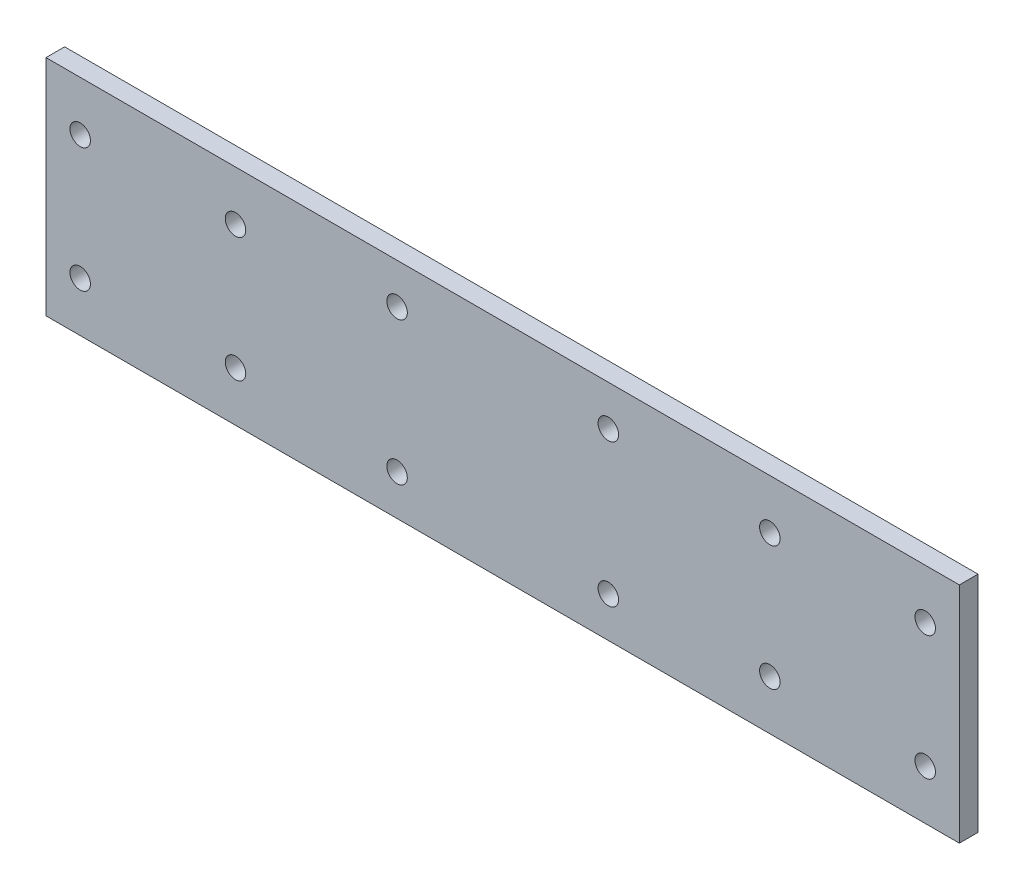
ISO-10303-21;
HEADER;
FILE_DESCRIPTION(('STEP AP214'),'2;1');
FILE_NAME('part.step','',(''),(''),'','','');
FILE_SCHEMA(('AUTOMOTIVE_DESIGN { 1 0 10303 214 1 1 1 1 }'));
ENDSEC;
DATA;
#1=APPLICATION_CONTEXT('core data for automotive mechanical design processes');
#2=APPLICATION_PROTOCOL_DEFINITION('international standard','automotive_design',2000,#1);
#3=PRODUCT_CONTEXT('',#1,'mechanical');
#4=PRODUCT('Part','Part','',(#3));
#5=PRODUCT_RELATED_PRODUCT_CATEGORY('part','',(#4));
#6=PRODUCT_DEFINITION_FORMATION('','',#4);
#7=PRODUCT_DEFINITION_CONTEXT('part definition',#1,'design');
#8=PRODUCT_DEFINITION('design','',#6,#7);
#9=PRODUCT_DEFINITION_SHAPE('','',#8);
#10=(LENGTH_UNIT() NAMED_UNIT(*) SI_UNIT(.MILLI.,.METRE.));
#11=(NAMED_UNIT(*) PLANE_ANGLE_UNIT() SI_UNIT($,.RADIAN.));
#12=(NAMED_UNIT(*) SI_UNIT($,.STERADIAN.) SOLID_ANGLE_UNIT());
#13=UNCERTAINTY_MEASURE_WITH_UNIT(LENGTH_MEASURE(1.E-05),#10,'distance_accuracy_value','');
#14=(GEOMETRIC_REPRESENTATION_CONTEXT(3) GLOBAL_UNCERTAINTY_ASSIGNED_CONTEXT((#13)) GLOBAL_UNIT_ASSIGNED_CONTEXT((#10,
#11,#12)) REPRESENTATION_CONTEXT('',''));
#15=CARTESIAN_POINT('',(0.,0.,0.));
#16=DIRECTION('',(0.,0.,1.));
#17=DIRECTION('',(1.,0.,0.));
#18=AXIS2_PLACEMENT_3D('',#15,#16,#17);
#19=CARTESIAN_POINT('',(73.5,18.,3.));
#20=DIRECTION('',(-1.,0.,0.));
#21=DIRECTION('',(0.,0.,1.));
#22=AXIS2_PLACEMENT_3D('',#19,#20,#21);
#23=PLANE('',#22);
#24=DIRECTION('',(0.,1.,0.));
#25=VECTOR('',#24,1.);
#26=CARTESIAN_POINT('',(73.5,18.,0.));
#27=LINE('',#26,#25);
#28=CARTESIAN_POINT('',(73.5,-18.,0.));
#29=VERTEX_POINT('',#28);
#30=CARTESIAN_POINT('',(73.5,18.,0.));
#31=VERTEX_POINT('',#30);
#32=EDGE_CURVE('E98',#29,#31,#27,.T.);
#33=ORIENTED_EDGE('',*,*,#32,.T.);
#34=DIRECTION('',(0.,0.,-1.));
#35=VECTOR('',#34,1.);
#36=CARTESIAN_POINT('',(73.5,18.,3.));
#37=LINE('',#36,#35);
#38=CARTESIAN_POINT('',(73.5,18.,3.));
#39=VERTEX_POINT('',#38);
#40=EDGE_CURVE('E11',#39,#31,#37,.T.);
#41=ORIENTED_EDGE('',*,*,#40,.F.);
#42=DIRECTION('',(0.,1.,0.));
#43=VECTOR('',#42,1.);
#44=CARTESIAN_POINT('',(73.5,18.,3.));
#45=LINE('',#44,#43);
#46=CARTESIAN_POINT('',(73.5,-18.,3.));
#47=VERTEX_POINT('',#46);
#48=EDGE_CURVE('E86',#47,#39,#45,.T.);
#49=ORIENTED_EDGE('',*,*,#48,.F.);
#50=DIRECTION('',(0.,0.,-1.));
#51=VECTOR('',#50,1.);
#52=CARTESIAN_POINT('',(73.5,-18.,3.));
#53=LINE('',#52,#51);
#54=EDGE_CURVE('E94',#47,#29,#53,.T.);
#55=ORIENTED_EDGE('',*,*,#54,.T.);
#56=EDGE_LOOP('',(#33,#41,#49,#55));
#57=FACE_BOUND('',#56,.T.);
#58=ADVANCED_FACE('F35',(#57),#23,.F.);
#59=CARTESIAN_POINT('',(-73.5,18.,3.));
#60=DIRECTION('',(0.,-1.,0.));
#61=DIRECTION('',(0.,0.,-1.));
#62=AXIS2_PLACEMENT_3D('',#59,#60,#61);
#63=PLANE('',#62);
#64=DIRECTION('',(-1.,0.,0.));
#65=VECTOR('',#64,1.);
#66=CARTESIAN_POINT('',(-73.5,18.,0.));
#67=LINE('',#66,#65);
#68=CARTESIAN_POINT('',(-73.5,18.,0.));
#69=VERTEX_POINT('',#68);
#70=EDGE_CURVE('E90',#31,#69,#67,.T.);
#71=ORIENTED_EDGE('',*,*,#70,.T.);
#72=DIRECTION('',(0.,0.,-1.));
#73=VECTOR('',#72,1.);
#74=CARTESIAN_POINT('',(-73.5,18.,3.));
#75=LINE('',#74,#73);
#76=CARTESIAN_POINT('',(-73.5,18.,3.));
#77=VERTEX_POINT('',#76);
#78=EDGE_CURVE('E43',#77,#69,#75,.T.);
#79=ORIENTED_EDGE('',*,*,#78,.F.);
#80=DIRECTION('',(-1.,0.,0.));
#81=VECTOR('',#80,1.);
#82=CARTESIAN_POINT('',(-73.5,18.,3.));
#83=LINE('',#82,#81);
#84=EDGE_CURVE('E81',#39,#77,#83,.T.);
#85=ORIENTED_EDGE('',*,*,#84,.F.);
#86=ORIENTED_EDGE('',*,*,#40,.T.);
#87=EDGE_LOOP('',(#71,#79,#85,#86));
#88=FACE_BOUND('',#87,.T.);
#89=ADVANCED_FACE('F89',(#88),#63,.F.);
#90=CARTESIAN_POINT('',(-73.5,18.,3.));
#91=DIRECTION('',(1.,0.,0.));
#92=DIRECTION('',(0.,0.,-1.));
#93=AXIS2_PLACEMENT_3D('',#90,#91,#92);
#94=PLANE('',#93);
#95=DIRECTION('',(0.,-1.,0.));
#96=VECTOR('',#95,1.);
#97=CARTESIAN_POINT('',(-73.5,18.,0.));
#98=LINE('',#97,#96);
#99=CARTESIAN_POINT('',(-73.5,-18.,0.));
#100=VERTEX_POINT('',#99);
#101=EDGE_CURVE('E68',#69,#100,#98,.T.);
#102=ORIENTED_EDGE('',*,*,#101,.T.);
#103=DIRECTION('',(0.,0.,-1.));
#104=VECTOR('',#103,1.);
#105=CARTESIAN_POINT('',(-73.5,-18.,3.));
#106=LINE('',#105,#104);
#107=CARTESIAN_POINT('',(-73.5,-18.,3.));
#108=VERTEX_POINT('',#107);
#109=EDGE_CURVE('E91',#108,#100,#106,.T.);
#110=ORIENTED_EDGE('',*,*,#109,.F.);
#111=DIRECTION('',(0.,-1.,0.));
#112=VECTOR('',#111,1.);
#113=CARTESIAN_POINT('',(-73.5,18.,3.));
#114=LINE('',#113,#112);
#115=EDGE_CURVE('E84',#77,#108,#114,.T.);
#116=ORIENTED_EDGE('',*,*,#115,.F.);
#117=ORIENTED_EDGE('',*,*,#78,.T.);
#118=EDGE_LOOP('',(#102,#110,#116,#117));
#119=FACE_BOUND('',#118,.T.);
#120=ADVANCED_FACE('F92',(#119),#94,.F.);
#121=CARTESIAN_POINT('',(-73.5,-18.,3.));
#122=DIRECTION('',(0.,1.,0.));
#123=DIRECTION('',(0.,0.,1.));
#124=AXIS2_PLACEMENT_3D('',#121,#122,#123);
#125=PLANE('',#124);
#126=DIRECTION('',(1.,0.,0.));
#127=VECTOR('',#126,1.);
#128=CARTESIAN_POINT('',(-73.5,-18.,0.));
#129=LINE('',#128,#127);
#130=EDGE_CURVE('E74',#100,#29,#129,.T.);
#131=ORIENTED_EDGE('',*,*,#130,.T.);
#132=ORIENTED_EDGE('',*,*,#54,.F.);
#133=DIRECTION('',(1.,0.,0.));
#134=VECTOR('',#133,1.);
#135=CARTESIAN_POINT('',(-73.5,-18.,3.));
#136=LINE('',#135,#134);
#137=EDGE_CURVE('E51',#108,#47,#136,.T.);
#138=ORIENTED_EDGE('',*,*,#137,.F.);
#139=ORIENTED_EDGE('',*,*,#109,.T.);
#140=EDGE_LOOP('',(#131,#132,#138,#139));
#141=FACE_BOUND('',#140,.T.);
#142=ADVANCED_FACE('F106',(#141),#125,.F.);
#143=CARTESIAN_POINT('',(0.,0.,3.));
#144=DIRECTION('',(0.,0.,1.));
#145=DIRECTION('',(1.,0.,0.));
#146=AXIS2_PLACEMENT_3D('',#143,#144,#145);
#147=PLANE('',#146);
#148=CARTESIAN_POINT('',(68.0000000000121,-10.,3.));
#149=DIRECTION('',(0.,0.,1.));
#150=DIRECTION('',(1.,0.,0.));
#151=AXIS2_PLACEMENT_3D('',#148,#149,#150);
#152=CIRCLE('',#151,1.64999999999998);
#153=CARTESIAN_POINT('',(69.650000000012,-10.,3.));
#154=VERTEX_POINT('',#153);
#155=EDGE_CURVE('E180',#154,#154,#152,.T.);
#156=ORIENTED_EDGE('',*,*,#155,.F.);
#157=EDGE_LOOP('',(#156));
#158=FACE_BOUND('',#157,.T.);
#159=CARTESIAN_POINT('',(43.0000000000121,-10.,3.));
#160=DIRECTION('',(0.,0.,1.));
#161=DIRECTION('',(1.,0.,0.));
#162=AXIS2_PLACEMENT_3D('',#159,#160,#161);
#163=CIRCLE('',#162,1.64999999999999);
#164=CARTESIAN_POINT('',(44.650000000012,-10.,3.));
#165=VERTEX_POINT('',#164);
#166=EDGE_CURVE('E174',#165,#165,#163,.T.);
#167=ORIENTED_EDGE('',*,*,#166,.F.);
#168=EDGE_LOOP('',(#167));
#169=FACE_BOUND('',#168,.T.);
#170=CARTESIAN_POINT('',(68.0000000000121,10.,3.));
#171=DIRECTION('',(0.,0.,1.));
#172=DIRECTION('',(1.,0.,0.));
#173=AXIS2_PLACEMENT_3D('',#170,#171,#172);
#174=CIRCLE('',#173,1.64999999999998);
#175=CARTESIAN_POINT('',(69.650000000012,10.,3.));
#176=VERTEX_POINT('',#175);
#177=EDGE_CURVE('E168',#176,#176,#174,.T.);
#178=ORIENTED_EDGE('',*,*,#177,.F.);
#179=EDGE_LOOP('',(#178));
#180=FACE_BOUND('',#179,.T.);
#181=CARTESIAN_POINT('',(43.0000000000121,10.,3.));
#182=DIRECTION('',(0.,0.,1.));
#183=DIRECTION('',(1.,0.,0.));
#184=AXIS2_PLACEMENT_3D('',#181,#182,#183);
#185=CIRCLE('',#184,1.64999999999999);
#186=CARTESIAN_POINT('',(44.650000000012,10.,3.));
#187=VERTEX_POINT('',#186);
#188=EDGE_CURVE('E162',#187,#187,#185,.T.);
#189=ORIENTED_EDGE('',*,*,#188,.F.);
#190=EDGE_LOOP('',(#189));
#191=FACE_BOUND('',#190,.T.);
#192=CARTESIAN_POINT('',(-68.0000000000121,10.,3.));
#193=DIRECTION('',(0.,0.,1.));
#194=DIRECTION('',(1.,0.,0.));
#195=AXIS2_PLACEMENT_3D('',#192,#193,#194);
#196=CIRCLE('',#195,1.64999999999998);
#197=CARTESIAN_POINT('',(-66.3500000000121,10.,3.));
#198=VERTEX_POINT('',#197);
#199=EDGE_CURVE('E156',#198,#198,#196,.T.);
#200=ORIENTED_EDGE('',*,*,#199,.F.);
#201=EDGE_LOOP('',(#200));
#202=FACE_BOUND('',#201,.T.);
#203=CARTESIAN_POINT('',(-43.0000000000121,10.,3.));
#204=DIRECTION('',(0.,0.,1.));
#205=DIRECTION('',(1.,0.,0.));
#206=AXIS2_PLACEMENT_3D('',#203,#204,#205);
#207=CIRCLE('',#206,1.64999999999999);
#208=CARTESIAN_POINT('',(-41.3500000000121,10.,3.));
#209=VERTEX_POINT('',#208);
#210=EDGE_CURVE('E150',#209,#209,#207,.T.);
#211=ORIENTED_EDGE('',*,*,#210,.F.);
#212=EDGE_LOOP('',(#211));
#213=FACE_BOUND('',#212,.T.);
#214=CARTESIAN_POINT('',(-68.0000000000121,-10.,3.));
#215=DIRECTION('',(0.,0.,1.));
#216=DIRECTION('',(1.,0.,0.));
#217=AXIS2_PLACEMENT_3D('',#214,#215,#216);
#218=CIRCLE('',#217,1.64999999999998);
#219=CARTESIAN_POINT('',(-66.3500000000121,-10.,3.));
#220=VERTEX_POINT('',#219);
#221=EDGE_CURVE('E144',#220,#220,#218,.T.);
#222=ORIENTED_EDGE('',*,*,#221,.F.);
#223=EDGE_LOOP('',(#222));
#224=FACE_BOUND('',#223,.T.);
#225=CARTESIAN_POINT('',(-43.0000000000121,-10.,3.));
#226=DIRECTION('',(0.,0.,1.));
#227=DIRECTION('',(1.,0.,0.));
#228=AXIS2_PLACEMENT_3D('',#225,#226,#227);
#229=CIRCLE('',#228,1.64999999999999);
#230=CARTESIAN_POINT('',(-41.3500000000121,-10.,3.));
#231=VERTEX_POINT('',#230);
#232=EDGE_CURVE('E138',#231,#231,#229,.T.);
#233=ORIENTED_EDGE('',*,*,#232,.F.);
#234=EDGE_LOOP('',(#233));
#235=FACE_BOUND('',#234,.T.);
#236=CARTESIAN_POINT('',(17.,11.5000000000001,3.));
#237=DIRECTION('',(0.,0.,1.));
#238=DIRECTION('',(1.,0.,0.));
#239=AXIS2_PLACEMENT_3D('',#236,#237,#238);
#240=CIRCLE('',#239,1.64999999999999);
#241=CARTESIAN_POINT('',(18.65,11.5000000000001,3.));
#242=VERTEX_POINT('',#241);
#243=EDGE_CURVE('E132',#242,#242,#240,.T.);
#244=ORIENTED_EDGE('',*,*,#243,.F.);
#245=EDGE_LOOP('',(#244));
#246=FACE_BOUND('',#245,.T.);
#247=CARTESIAN_POINT('',(17.,-11.5000000000001,3.));
#248=DIRECTION('',(0.,0.,1.));
#249=DIRECTION('',(1.,0.,0.));
#250=AXIS2_PLACEMENT_3D('',#247,#248,#249);
#251=CIRCLE('',#250,1.64999999999999);
#252=CARTESIAN_POINT('',(18.65,-11.5000000000001,3.));
#253=VERTEX_POINT('',#252);
#254=EDGE_CURVE('E126',#253,#253,#251,.T.);
#255=ORIENTED_EDGE('',*,*,#254,.F.);
#256=EDGE_LOOP('',(#255));
#257=FACE_BOUND('',#256,.T.);
#258=CARTESIAN_POINT('',(-17.,-11.5000000000001,3.));
#259=DIRECTION('',(0.,0.,1.));
#260=DIRECTION('',(1.,0.,0.));
#261=AXIS2_PLACEMENT_3D('',#258,#259,#260);
#262=CIRCLE('',#261,1.64999999999999);
#263=CARTESIAN_POINT('',(-15.35,-11.5000000000001,3.));
#264=VERTEX_POINT('',#263);
#265=EDGE_CURVE('E120',#264,#264,#262,.T.);
#266=ORIENTED_EDGE('',*,*,#265,.F.);
#267=EDGE_LOOP('',(#266));
#268=FACE_BOUND('',#267,.T.);
#269=CARTESIAN_POINT('',(-17.,11.5000000000001,3.));
#270=DIRECTION('',(0.,0.,1.));
#271=DIRECTION('',(1.,0.,0.));
#272=AXIS2_PLACEMENT_3D('',#269,#270,#271);
#273=CIRCLE('',#272,1.64999999999999);
#274=CARTESIAN_POINT('',(-15.35,11.5000000000001,3.));
#275=VERTEX_POINT('',#274);
#276=EDGE_CURVE('E114',#275,#275,#273,.T.);
#277=ORIENTED_EDGE('',*,*,#276,.F.);
#278=EDGE_LOOP('',(#277));
#279=FACE_BOUND('',#278,.T.);
#280=ORIENTED_EDGE('',*,*,#48,.T.);
#281=ORIENTED_EDGE('',*,*,#84,.T.);
#282=ORIENTED_EDGE('',*,*,#115,.T.);
#283=ORIENTED_EDGE('',*,*,#137,.T.);
#284=EDGE_LOOP('',(#280,#281,#282,#283));
#285=FACE_BOUND('',#284,.T.);
#286=ADVANCED_FACE('F82',(#158,#169,#180,#191,#202,#213,#224,#235,#246,#257,#268,#279,#285),
#147,.T.);
#287=CARTESIAN_POINT('',(0.,0.,0.));
#288=DIRECTION('',(0.,0.,1.));
#289=DIRECTION('',(1.,0.,0.));
#290=AXIS2_PLACEMENT_3D('',#287,#288,#289);
#291=PLANE('',#290);
#292=CARTESIAN_POINT('',(68.0000000000121,-10.,0.));
#293=DIRECTION('',(0.,0.,1.));
#294=DIRECTION('',(1.,0.,0.));
#295=AXIS2_PLACEMENT_3D('',#292,#293,#294);
#296=CIRCLE('',#295,1.64999999999998);
#297=CARTESIAN_POINT('',(69.650000000012,-10.,0.));
#298=VERTEX_POINT('',#297);
#299=EDGE_CURVE('E177',#298,#298,#296,.T.);
#300=ORIENTED_EDGE('',*,*,#299,.T.);
#301=EDGE_LOOP('',(#300));
#302=FACE_BOUND('',#301,.T.);
#303=CARTESIAN_POINT('',(43.0000000000121,-10.,0.));
#304=DIRECTION('',(0.,0.,1.));
#305=DIRECTION('',(1.,0.,0.));
#306=AXIS2_PLACEMENT_3D('',#303,#304,#305);
#307=CIRCLE('',#306,1.64999999999999);
#308=CARTESIAN_POINT('',(44.650000000012,-10.,0.));
#309=VERTEX_POINT('',#308);
#310=EDGE_CURVE('E171',#309,#309,#307,.T.);
#311=ORIENTED_EDGE('',*,*,#310,.T.);
#312=EDGE_LOOP('',(#311));
#313=FACE_BOUND('',#312,.T.);
#314=CARTESIAN_POINT('',(68.0000000000121,10.,0.));
#315=DIRECTION('',(0.,0.,1.));
#316=DIRECTION('',(1.,0.,0.));
#317=AXIS2_PLACEMENT_3D('',#314,#315,#316);
#318=CIRCLE('',#317,1.64999999999998);
#319=CARTESIAN_POINT('',(69.650000000012,10.,0.));
#320=VERTEX_POINT('',#319);
#321=EDGE_CURVE('E165',#320,#320,#318,.T.);
#322=ORIENTED_EDGE('',*,*,#321,.T.);
#323=EDGE_LOOP('',(#322));
#324=FACE_BOUND('',#323,.T.);
#325=CARTESIAN_POINT('',(43.0000000000121,10.,0.));
#326=DIRECTION('',(0.,0.,1.));
#327=DIRECTION('',(1.,0.,0.));
#328=AXIS2_PLACEMENT_3D('',#325,#326,#327);
#329=CIRCLE('',#328,1.64999999999999);
#330=CARTESIAN_POINT('',(44.650000000012,10.,0.));
#331=VERTEX_POINT('',#330);
#332=EDGE_CURVE('E159',#331,#331,#329,.T.);
#333=ORIENTED_EDGE('',*,*,#332,.T.);
#334=EDGE_LOOP('',(#333));
#335=FACE_BOUND('',#334,.T.);
#336=CARTESIAN_POINT('',(-68.0000000000121,10.,0.));
#337=DIRECTION('',(0.,0.,1.));
#338=DIRECTION('',(1.,0.,0.));
#339=AXIS2_PLACEMENT_3D('',#336,#337,#338);
#340=CIRCLE('',#339,1.64999999999998);
#341=CARTESIAN_POINT('',(-66.3500000000121,10.,0.));
#342=VERTEX_POINT('',#341);
#343=EDGE_CURVE('E153',#342,#342,#340,.T.);
#344=ORIENTED_EDGE('',*,*,#343,.T.);
#345=EDGE_LOOP('',(#344));
#346=FACE_BOUND('',#345,.T.);
#347=CARTESIAN_POINT('',(-43.0000000000121,10.,0.));
#348=DIRECTION('',(0.,0.,1.));
#349=DIRECTION('',(1.,0.,0.));
#350=AXIS2_PLACEMENT_3D('',#347,#348,#349);
#351=CIRCLE('',#350,1.64999999999999);
#352=CARTESIAN_POINT('',(-41.3500000000121,10.,0.));
#353=VERTEX_POINT('',#352);
#354=EDGE_CURVE('E147',#353,#353,#351,.T.);
#355=ORIENTED_EDGE('',*,*,#354,.T.);
#356=EDGE_LOOP('',(#355));
#357=FACE_BOUND('',#356,.T.);
#358=CARTESIAN_POINT('',(-68.0000000000121,-10.,0.));
#359=DIRECTION('',(0.,0.,1.));
#360=DIRECTION('',(1.,0.,0.));
#361=AXIS2_PLACEMENT_3D('',#358,#359,#360);
#362=CIRCLE('',#361,1.64999999999998);
#363=CARTESIAN_POINT('',(-66.3500000000121,-10.,0.));
#364=VERTEX_POINT('',#363);
#365=EDGE_CURVE('E141',#364,#364,#362,.T.);
#366=ORIENTED_EDGE('',*,*,#365,.T.);
#367=EDGE_LOOP('',(#366));
#368=FACE_BOUND('',#367,.T.);
#369=CARTESIAN_POINT('',(-43.0000000000121,-10.,0.));
#370=DIRECTION('',(0.,0.,1.));
#371=DIRECTION('',(1.,0.,0.));
#372=AXIS2_PLACEMENT_3D('',#369,#370,#371);
#373=CIRCLE('',#372,1.64999999999999);
#374=CARTESIAN_POINT('',(-41.3500000000121,-10.,0.));
#375=VERTEX_POINT('',#374);
#376=EDGE_CURVE('E135',#375,#375,#373,.T.);
#377=ORIENTED_EDGE('',*,*,#376,.T.);
#378=EDGE_LOOP('',(#377));
#379=FACE_BOUND('',#378,.T.);
#380=CARTESIAN_POINT('',(17.,11.5000000000001,0.));
#381=DIRECTION('',(0.,0.,1.));
#382=DIRECTION('',(1.,0.,0.));
#383=AXIS2_PLACEMENT_3D('',#380,#381,#382);
#384=CIRCLE('',#383,1.64999999999999);
#385=CARTESIAN_POINT('',(18.65,11.5000000000001,0.));
#386=VERTEX_POINT('',#385);
#387=EDGE_CURVE('E129',#386,#386,#384,.T.);
#388=ORIENTED_EDGE('',*,*,#387,.T.);
#389=EDGE_LOOP('',(#388));
#390=FACE_BOUND('',#389,.T.);
#391=CARTESIAN_POINT('',(17.,-11.5000000000001,0.));
#392=DIRECTION('',(0.,0.,1.));
#393=DIRECTION('',(1.,0.,0.));
#394=AXIS2_PLACEMENT_3D('',#391,#392,#393);
#395=CIRCLE('',#394,1.64999999999999);
#396=CARTESIAN_POINT('',(18.65,-11.5000000000001,0.));
#397=VERTEX_POINT('',#396);
#398=EDGE_CURVE('E123',#397,#397,#395,.T.);
#399=ORIENTED_EDGE('',*,*,#398,.T.);
#400=EDGE_LOOP('',(#399));
#401=FACE_BOUND('',#400,.T.);
#402=CARTESIAN_POINT('',(-17.,-11.5000000000001,0.));
#403=DIRECTION('',(0.,0.,1.));
#404=DIRECTION('',(1.,0.,0.));
#405=AXIS2_PLACEMENT_3D('',#402,#403,#404);
#406=CIRCLE('',#405,1.64999999999999);
#407=CARTESIAN_POINT('',(-15.35,-11.5000000000001,0.));
#408=VERTEX_POINT('',#407);
#409=EDGE_CURVE('E117',#408,#408,#406,.T.);
#410=ORIENTED_EDGE('',*,*,#409,.T.);
#411=EDGE_LOOP('',(#410));
#412=FACE_BOUND('',#411,.T.);
#413=CARTESIAN_POINT('',(-17.,11.5000000000001,0.));
#414=DIRECTION('',(0.,0.,1.));
#415=DIRECTION('',(1.,0.,0.));
#416=AXIS2_PLACEMENT_3D('',#413,#414,#415);
#417=CIRCLE('',#416,1.64999999999999);
#418=CARTESIAN_POINT('',(-15.35,11.5000000000001,0.));
#419=VERTEX_POINT('',#418);
#420=EDGE_CURVE('E101',#419,#419,#417,.T.);
#421=ORIENTED_EDGE('',*,*,#420,.T.);
#422=EDGE_LOOP('',(#421));
#423=FACE_BOUND('',#422,.T.);
#424=ORIENTED_EDGE('',*,*,#32,.F.);
#425=ORIENTED_EDGE('',*,*,#130,.F.);
#426=ORIENTED_EDGE('',*,*,#101,.F.);
#427=ORIENTED_EDGE('',*,*,#70,.F.);
#428=EDGE_LOOP('',(#424,#425,#426,#427));
#429=FACE_BOUND('',#428,.T.);
#430=ADVANCED_FACE('F109',(#302,#313,#324,#335,#346,#357,#368,#379,#390,#401,#412,#423,#429),
#291,.F.);
#431=CARTESIAN_POINT('',(-17.,11.5000000000001,3.));
#432=DIRECTION('',(0.,0.,1.));
#433=DIRECTION('',(1.,0.,0.));
#434=AXIS2_PLACEMENT_3D('',#431,#432,#433);
#435=CYLINDRICAL_SURFACE('',#434,1.64999999999999);
#436=ORIENTED_EDGE('',*,*,#276,.T.);
#437=EDGE_LOOP('',(#436));
#438=FACE_BOUND('',#437,.T.);
#439=ORIENTED_EDGE('',*,*,#420,.F.);
#440=EDGE_LOOP('',(#439));
#441=FACE_BOUND('',#440,.T.);
#442=ADVANCED_FACE('F212',(#438,#441),#435,.F.);
#443=CARTESIAN_POINT('',(-17.,-11.5000000000001,3.));
#444=DIRECTION('',(0.,0.,1.));
#445=DIRECTION('',(1.,0.,0.));
#446=AXIS2_PLACEMENT_3D('',#443,#444,#445);
#447=CYLINDRICAL_SURFACE('',#446,1.64999999999999);
#448=ORIENTED_EDGE('',*,*,#265,.T.);
#449=EDGE_LOOP('',(#448));
#450=FACE_BOUND('',#449,.T.);
#451=ORIENTED_EDGE('',*,*,#409,.F.);
#452=EDGE_LOOP('',(#451));
#453=FACE_BOUND('',#452,.T.);
#454=ADVANCED_FACE('F215',(#450,#453),#447,.F.);
#455=CARTESIAN_POINT('',(17.,-11.5000000000001,3.));
#456=DIRECTION('',(0.,0.,1.));
#457=DIRECTION('',(1.,0.,0.));
#458=AXIS2_PLACEMENT_3D('',#455,#456,#457);
#459=CYLINDRICAL_SURFACE('',#458,1.64999999999999);
#460=ORIENTED_EDGE('',*,*,#254,.T.);
#461=EDGE_LOOP('',(#460));
#462=FACE_BOUND('',#461,.T.);
#463=ORIENTED_EDGE('',*,*,#398,.F.);
#464=EDGE_LOOP('',(#463));
#465=FACE_BOUND('',#464,.T.);
#466=ADVANCED_FACE('F315',(#462,#465),#459,.F.);
#467=CARTESIAN_POINT('',(17.,11.5000000000001,3.));
#468=DIRECTION('',(0.,0.,1.));
#469=DIRECTION('',(1.,0.,0.));
#470=AXIS2_PLACEMENT_3D('',#467,#468,#469);
#471=CYLINDRICAL_SURFACE('',#470,1.64999999999999);
#472=ORIENTED_EDGE('',*,*,#243,.T.);
#473=EDGE_LOOP('',(#472));
#474=FACE_BOUND('',#473,.T.);
#475=ORIENTED_EDGE('',*,*,#387,.F.);
#476=EDGE_LOOP('',(#475));
#477=FACE_BOUND('',#476,.T.);
#478=ADVANCED_FACE('F311',(#474,#477),#471,.F.);
#479=CARTESIAN_POINT('',(-43.0000000000121,-10.,3.));
#480=DIRECTION('',(0.,0.,1.));
#481=DIRECTION('',(1.,0.,0.));
#482=AXIS2_PLACEMENT_3D('',#479,#480,#481);
#483=CYLINDRICAL_SURFACE('',#482,1.64999999999999);
#484=ORIENTED_EDGE('',*,*,#232,.T.);
#485=EDGE_LOOP('',(#484));
#486=FACE_BOUND('',#485,.T.);
#487=ORIENTED_EDGE('',*,*,#376,.F.);
#488=EDGE_LOOP('',(#487));
#489=FACE_BOUND('',#488,.T.);
#490=ADVANCED_FACE('F307',(#486,#489),#483,.F.);
#491=CARTESIAN_POINT('',(-68.0000000000121,-10.,3.));
#492=DIRECTION('',(0.,0.,1.));
#493=DIRECTION('',(1.,0.,0.));
#494=AXIS2_PLACEMENT_3D('',#491,#492,#493);
#495=CYLINDRICAL_SURFACE('',#494,1.64999999999998);
#496=ORIENTED_EDGE('',*,*,#221,.T.);
#497=EDGE_LOOP('',(#496));
#498=FACE_BOUND('',#497,.T.);
#499=ORIENTED_EDGE('',*,*,#365,.F.);
#500=EDGE_LOOP('',(#499));
#501=FACE_BOUND('',#500,.T.);
#502=ADVANCED_FACE('F303',(#498,#501),#495,.F.);
#503=CARTESIAN_POINT('',(-43.0000000000121,10.,3.));
#504=DIRECTION('',(0.,0.,1.));
#505=DIRECTION('',(1.,0.,0.));
#506=AXIS2_PLACEMENT_3D('',#503,#504,#505);
#507=CYLINDRICAL_SURFACE('',#506,1.64999999999999);
#508=ORIENTED_EDGE('',*,*,#210,.T.);
#509=EDGE_LOOP('',(#508));
#510=FACE_BOUND('',#509,.T.);
#511=ORIENTED_EDGE('',*,*,#354,.F.);
#512=EDGE_LOOP('',(#511));
#513=FACE_BOUND('',#512,.T.);
#514=ADVANCED_FACE('F299',(#510,#513),#507,.F.);
#515=CARTESIAN_POINT('',(-68.0000000000121,10.,3.));
#516=DIRECTION('',(0.,0.,1.));
#517=DIRECTION('',(1.,0.,0.));
#518=AXIS2_PLACEMENT_3D('',#515,#516,#517);
#519=CYLINDRICAL_SURFACE('',#518,1.64999999999998);
#520=ORIENTED_EDGE('',*,*,#199,.T.);
#521=EDGE_LOOP('',(#520));
#522=FACE_BOUND('',#521,.T.);
#523=ORIENTED_EDGE('',*,*,#343,.F.);
#524=EDGE_LOOP('',(#523));
#525=FACE_BOUND('',#524,.T.);
#526=ADVANCED_FACE('F250',(#522,#525),#519,.F.);
#527=CARTESIAN_POINT('',(43.0000000000121,10.,3.));
#528=DIRECTION('',(0.,0.,1.));
#529=DIRECTION('',(1.,0.,0.));
#530=AXIS2_PLACEMENT_3D('',#527,#528,#529);
#531=CYLINDRICAL_SURFACE('',#530,1.64999999999999);
#532=ORIENTED_EDGE('',*,*,#188,.T.);
#533=EDGE_LOOP('',(#532));
#534=FACE_BOUND('',#533,.T.);
#535=ORIENTED_EDGE('',*,*,#332,.F.);
#536=EDGE_LOOP('',(#535));
#537=FACE_BOUND('',#536,.T.);
#538=ADVANCED_FACE('F260',(#534,#537),#531,.F.);
#539=CARTESIAN_POINT('',(68.0000000000121,10.,3.));
#540=DIRECTION('',(0.,0.,1.));
#541=DIRECTION('',(1.,0.,0.));
#542=AXIS2_PLACEMENT_3D('',#539,#540,#541);
#543=CYLINDRICAL_SURFACE('',#542,1.64999999999998);
#544=ORIENTED_EDGE('',*,*,#177,.T.);
#545=EDGE_LOOP('',(#544));
#546=FACE_BOUND('',#545,.T.);
#547=ORIENTED_EDGE('',*,*,#321,.F.);
#548=EDGE_LOOP('',(#547));
#549=FACE_BOUND('',#548,.T.);
#550=ADVANCED_FACE('F265',(#546,#549),#543,.F.);
#551=CARTESIAN_POINT('',(43.0000000000121,-10.,3.));
#552=DIRECTION('',(0.,0.,1.));
#553=DIRECTION('',(1.,0.,0.));
#554=AXIS2_PLACEMENT_3D('',#551,#552,#553);
#555=CYLINDRICAL_SURFACE('',#554,1.64999999999999);
#556=ORIENTED_EDGE('',*,*,#166,.T.);
#557=EDGE_LOOP('',(#556));
#558=FACE_BOUND('',#557,.T.);
#559=ORIENTED_EDGE('',*,*,#310,.F.);
#560=EDGE_LOOP('',(#559));
#561=FACE_BOUND('',#560,.T.);
#562=ADVANCED_FACE('F275',(#558,#561),#555,.F.);
#563=CARTESIAN_POINT('',(68.0000000000121,-10.,3.));
#564=DIRECTION('',(0.,0.,1.));
#565=DIRECTION('',(1.,0.,0.));
#566=AXIS2_PLACEMENT_3D('',#563,#564,#565);
#567=CYLINDRICAL_SURFACE('',#566,1.64999999999998);
#568=ORIENTED_EDGE('',*,*,#155,.T.);
#569=EDGE_LOOP('',(#568));
#570=FACE_BOUND('',#569,.T.);
#571=ORIENTED_EDGE('',*,*,#299,.F.);
#572=EDGE_LOOP('',(#571));
#573=FACE_BOUND('',#572,.T.);
#574=ADVANCED_FACE('F184',(#570,#573),#567,.F.);
#575=CLOSED_SHELL('',(#58,#89,#120,#142,#286,#430,#442,#454,#466,#478,#490,#502,#514,#526,#538,
#550,#562,#574));
#576=MANIFOLD_SOLID_BREP('B2',#575);
#577=ADVANCED_BREP_SHAPE_REPRESENTATION('',(#18,#576),#14);
#578=SHAPE_DEFINITION_REPRESENTATION(#9,#577);
ENDSEC;
END-ISO-10303-21;
